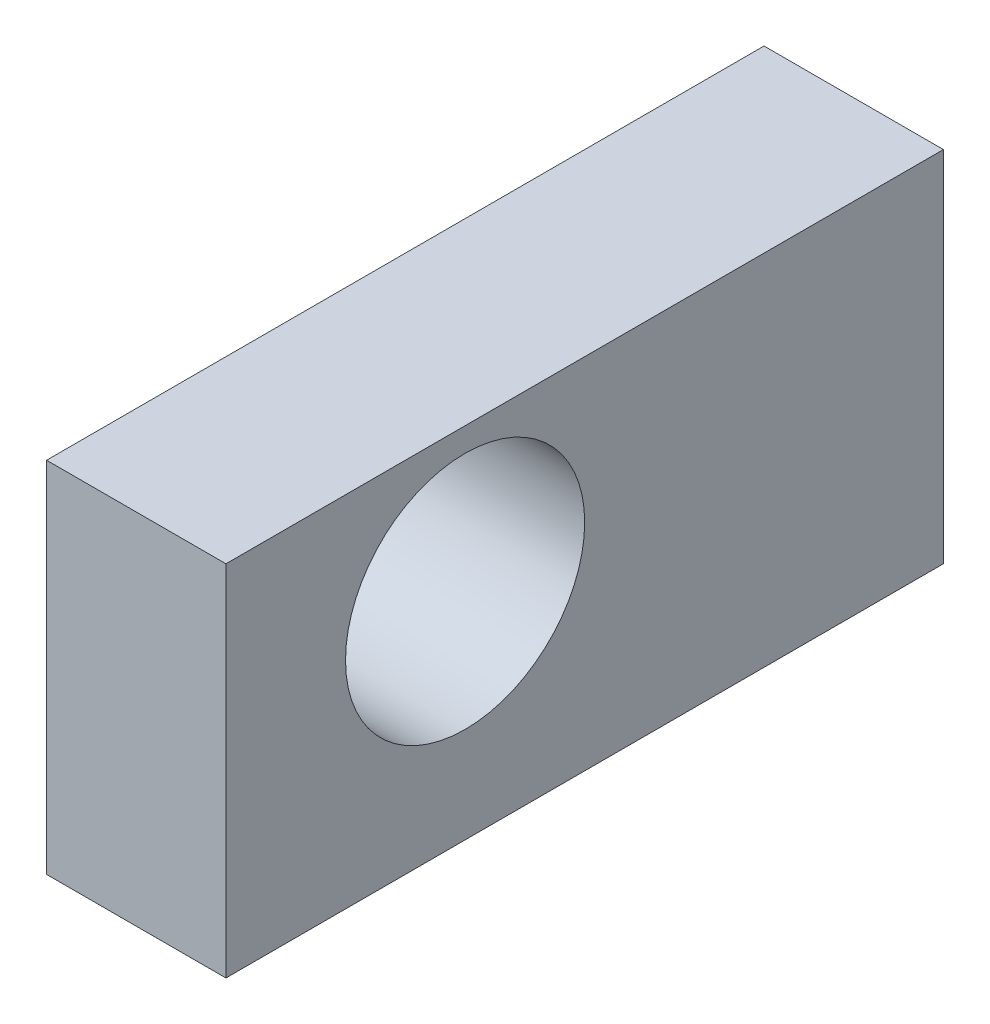
ISO-10303-21;
HEADER;
FILE_DESCRIPTION(('STEP AP214'),'2;1');
FILE_NAME('part.step','',(''),(''),'','','');
FILE_SCHEMA(('AUTOMOTIVE_DESIGN { 1 0 10303 214 1 1 1 1 }'));
ENDSEC;
DATA;
#1=APPLICATION_CONTEXT('core data for automotive mechanical design processes');
#2=APPLICATION_PROTOCOL_DEFINITION('international standard','automotive_design',2000,#1);
#3=PRODUCT_CONTEXT('',#1,'mechanical');
#4=PRODUCT('Part','Part','',(#3));
#5=PRODUCT_RELATED_PRODUCT_CATEGORY('part','',(#4));
#6=PRODUCT_DEFINITION_FORMATION('','',#4);
#7=PRODUCT_DEFINITION_CONTEXT('part definition',#1,'design');
#8=PRODUCT_DEFINITION('design','',#6,#7);
#9=PRODUCT_DEFINITION_SHAPE('','',#8);
#10=(LENGTH_UNIT() NAMED_UNIT(*) SI_UNIT(.MILLI.,.METRE.));
#11=(NAMED_UNIT(*) PLANE_ANGLE_UNIT() SI_UNIT($,.RADIAN.));
#12=(NAMED_UNIT(*) SI_UNIT($,.STERADIAN.) SOLID_ANGLE_UNIT());
#13=UNCERTAINTY_MEASURE_WITH_UNIT(LENGTH_MEASURE(1.E-05),#10,'distance_accuracy_value','');
#14=(GEOMETRIC_REPRESENTATION_CONTEXT(3) GLOBAL_UNCERTAINTY_ASSIGNED_CONTEXT((#13)) GLOBAL_UNIT_ASSIGNED_CONTEXT((#10,
#11,#12)) REPRESENTATION_CONTEXT('',''));
#15=CARTESIAN_POINT('',(0.,0.,0.));
#16=DIRECTION('',(0.,0.,1.));
#17=DIRECTION('',(1.,0.,0.));
#18=AXIS2_PLACEMENT_3D('',#15,#16,#17);
#19=CARTESIAN_POINT('',(9.525,-9.525,-19.05));
#20=DIRECTION('',(0.,0.,1.));
#21=DIRECTION('',(1.,0.,0.));
#22=AXIS2_PLACEMENT_3D('',#19,#20,#21);
#23=PLANE('',#22);
#24=CARTESIAN_POINT('',(4.7625,-3.175,-19.05));
#25=DIRECTION('',(0.,0.,-1.));
#26=DIRECTION('',(-1.,0.,0.));
#27=AXIS2_PLACEMENT_3D('',#24,#25,#26);
#28=CIRCLE('',#27,2.0193);
#29=CARTESIAN_POINT('',(2.7432,-3.175,-19.05));
#30=VERTEX_POINT('',#29);
#31=EDGE_CURVE('E104',#30,#30,#28,.T.);
#32=ORIENTED_EDGE('',*,*,#31,.F.);
#33=EDGE_LOOP('',(#32));
#34=FACE_BOUND('',#33,.T.);
#35=CARTESIAN_POINT('',(4.7625,5.715,-19.05));
#36=DIRECTION('',(0.,0.,-1.));
#37=DIRECTION('',(-1.,0.,0.));
#38=AXIS2_PLACEMENT_3D('',#35,#36,#37);
#39=CIRCLE('',#38,2.0193);
#40=CARTESIAN_POINT('',(2.7432,5.715,-19.05));
#41=VERTEX_POINT('',#40);
#42=EDGE_CURVE('E103',#41,#41,#39,.T.);
#43=ORIENTED_EDGE('',*,*,#42,.F.);
#44=EDGE_LOOP('',(#43));
#45=FACE_BOUND('',#44,.T.);
#46=DIRECTION('',(0.,1.,0.));
#47=VECTOR('',#46,1.);
#48=CARTESIAN_POINT('',(0.,-9.525,-19.05));
#49=LINE('',#48,#47);
#50=CARTESIAN_POINT('',(0.,-9.525,-19.05));
#51=VERTEX_POINT('',#50);
#52=CARTESIAN_POINT('',(0.,9.525,-19.05));
#53=VERTEX_POINT('',#52);
#54=EDGE_CURVE('E120',#51,#53,#49,.T.);
#55=ORIENTED_EDGE('',*,*,#54,.T.);
#56=DIRECTION('',(-1.,0.,0.));
#57=VECTOR('',#56,1.);
#58=CARTESIAN_POINT('',(9.525,9.525,-19.05));
#59=LINE('',#58,#57);
#60=CARTESIAN_POINT('',(9.525,9.525,-19.05));
#61=VERTEX_POINT('',#60);
#62=EDGE_CURVE('E11',#61,#53,#59,.T.);
#63=ORIENTED_EDGE('',*,*,#62,.F.);
#64=DIRECTION('',(0.,1.,0.));
#65=VECTOR('',#64,1.);
#66=CARTESIAN_POINT('',(9.525,-9.525,-19.05));
#67=LINE('',#66,#65);
#68=CARTESIAN_POINT('',(9.525,-9.525,-19.05));
#69=VERTEX_POINT('',#68);
#70=EDGE_CURVE('E121',#69,#61,#67,.T.);
#71=ORIENTED_EDGE('',*,*,#70,.F.);
#72=DIRECTION('',(-1.,0.,0.));
#73=VECTOR('',#72,1.);
#74=CARTESIAN_POINT('',(9.525,-9.525,-19.05));
#75=LINE('',#74,#73);
#76=EDGE_CURVE('E127',#69,#51,#75,.T.);
#77=ORIENTED_EDGE('',*,*,#76,.T.);
#78=EDGE_LOOP('',(#55,#63,#71,#77));
#79=FACE_BOUND('',#78,.T.);
#80=ADVANCED_FACE('F39',(#34,#45,#79),#23,.F.);
#81=CARTESIAN_POINT('',(9.525,9.525,19.05));
#82=DIRECTION('',(0.,-1.,0.));
#83=DIRECTION('',(0.,0.,-1.));
#84=AXIS2_PLACEMENT_3D('',#81,#82,#83);
#85=PLANE('',#84);
#86=DIRECTION('',(0.,0.,1.));
#87=VECTOR('',#86,1.);
#88=CARTESIAN_POINT('',(0.,9.525,19.05));
#89=LINE('',#88,#87);
#90=CARTESIAN_POINT('',(0.,9.525,19.05));
#91=VERTEX_POINT('',#90);
#92=EDGE_CURVE('E130',#53,#91,#89,.T.);
#93=ORIENTED_EDGE('',*,*,#92,.T.);
#94=DIRECTION('',(-1.,0.,0.));
#95=VECTOR('',#94,1.);
#96=CARTESIAN_POINT('',(9.525,9.525,19.05));
#97=LINE('',#96,#95);
#98=CARTESIAN_POINT('',(9.525,9.525,19.05));
#99=VERTEX_POINT('',#98);
#100=EDGE_CURVE('E47',#99,#91,#97,.T.);
#101=ORIENTED_EDGE('',*,*,#100,.F.);
#102=DIRECTION('',(0.,0.,1.));
#103=VECTOR('',#102,1.);
#104=CARTESIAN_POINT('',(9.525,9.525,19.05));
#105=LINE('',#104,#103);
#106=EDGE_CURVE('E86',#61,#99,#105,.T.);
#107=ORIENTED_EDGE('',*,*,#106,.F.);
#108=ORIENTED_EDGE('',*,*,#62,.T.);
#109=EDGE_LOOP('',(#93,#101,#107,#108));
#110=FACE_BOUND('',#109,.T.);
#111=ADVANCED_FACE('F154',(#110),#85,.F.);
#112=CARTESIAN_POINT('',(9.525,-9.525,19.05));
#113=DIRECTION('',(0.,0.,-1.));
#114=DIRECTION('',(-1.,0.,0.));
#115=AXIS2_PLACEMENT_3D('',#112,#113,#114);
#116=PLANE('',#115);
#117=DIRECTION('',(0.,-1.,0.));
#118=VECTOR('',#117,1.);
#119=CARTESIAN_POINT('',(0.,-9.525,19.05));
#120=LINE('',#119,#118);
#121=CARTESIAN_POINT('',(0.,-9.525,19.05));
#122=VERTEX_POINT('',#121);
#123=EDGE_CURVE('E73',#91,#122,#120,.T.);
#124=ORIENTED_EDGE('',*,*,#123,.T.);
#125=DIRECTION('',(-1.,0.,0.));
#126=VECTOR('',#125,1.);
#127=CARTESIAN_POINT('',(9.525,-9.525,19.05));
#128=LINE('',#127,#126);
#129=CARTESIAN_POINT('',(9.525,-9.525,19.05));
#130=VERTEX_POINT('',#129);
#131=EDGE_CURVE('E135',#130,#122,#128,.T.);
#132=ORIENTED_EDGE('',*,*,#131,.F.);
#133=DIRECTION('',(0.,-1.,0.));
#134=VECTOR('',#133,1.);
#135=CARTESIAN_POINT('',(9.525,-9.525,19.05));
#136=LINE('',#135,#134);
#137=EDGE_CURVE('E124',#99,#130,#136,.T.);
#138=ORIENTED_EDGE('',*,*,#137,.F.);
#139=ORIENTED_EDGE('',*,*,#100,.T.);
#140=EDGE_LOOP('',(#124,#132,#138,#139));
#141=FACE_BOUND('',#140,.T.);
#142=ADVANCED_FACE('F137',(#141),#116,.F.);
#143=CARTESIAN_POINT('',(9.525,-9.525,19.05));
#144=DIRECTION('',(0.,1.,0.));
#145=DIRECTION('',(0.,0.,1.));
#146=AXIS2_PLACEMENT_3D('',#143,#144,#145);
#147=PLANE('',#146);
#148=DIRECTION('',(0.,0.,-1.));
#149=VECTOR('',#148,1.);
#150=CARTESIAN_POINT('',(0.,-9.525,19.05));
#151=LINE('',#150,#149);
#152=EDGE_CURVE('E79',#122,#51,#151,.T.);
#153=ORIENTED_EDGE('',*,*,#152,.T.);
#154=ORIENTED_EDGE('',*,*,#76,.F.);
#155=DIRECTION('',(0.,0.,-1.));
#156=VECTOR('',#155,1.);
#157=CARTESIAN_POINT('',(9.525,-9.525,19.05));
#158=LINE('',#157,#156);
#159=EDGE_CURVE('E55',#130,#69,#158,.T.);
#160=ORIENTED_EDGE('',*,*,#159,.F.);
#161=ORIENTED_EDGE('',*,*,#131,.T.);
#162=EDGE_LOOP('',(#153,#154,#160,#161));
#163=FACE_BOUND('',#162,.T.);
#164=ADVANCED_FACE('F144',(#163),#147,.F.);
#165=CARTESIAN_POINT('',(9.525,0.,0.));
#166=DIRECTION('',(-1.,0.,0.));
#167=DIRECTION('',(0.,0.,1.));
#168=AXIS2_PLACEMENT_3D('',#165,#166,#167);
#169=PLANE('',#168);
#170=CARTESIAN_POINT('',(9.525,1.905,6.35));
#171=DIRECTION('',(1.,0.,0.));
#172=DIRECTION('',(0.,0.,-1.));
#173=AXIS2_PLACEMENT_3D('',#170,#171,#172);
#174=CIRCLE('',#173,6.34999999999999);
#175=CARTESIAN_POINT('',(9.525,1.905,0.));
#176=VERTEX_POINT('',#175);
#177=EDGE_CURVE('E114',#176,#176,#174,.T.);
#178=ORIENTED_EDGE('',*,*,#177,.F.);
#179=EDGE_LOOP('',(#178));
#180=FACE_BOUND('',#179,.T.);
#181=ORIENTED_EDGE('',*,*,#70,.T.);
#182=ORIENTED_EDGE('',*,*,#106,.T.);
#183=ORIENTED_EDGE('',*,*,#137,.T.);
#184=ORIENTED_EDGE('',*,*,#159,.T.);
#185=EDGE_LOOP('',(#181,#182,#183,#184));
#186=FACE_BOUND('',#185,.T.);
#187=ADVANCED_FACE('F146',(#180,#186),#169,.F.);
#188=CARTESIAN_POINT('',(0.,0.,0.));
#189=DIRECTION('',(-1.,0.,0.));
#190=DIRECTION('',(0.,0.,1.));
#191=AXIS2_PLACEMENT_3D('',#188,#189,#190);
#192=PLANE('',#191);
#193=CARTESIAN_POINT('',(0.,1.905,6.35));
#194=DIRECTION('',(-1.,0.,0.));
#195=DIRECTION('',(0.,0.,1.));
#196=AXIS2_PLACEMENT_3D('',#193,#194,#195);
#197=CIRCLE('',#196,6.34999999999999);
#198=CARTESIAN_POINT('',(0.,1.905,12.7));
#199=VERTEX_POINT('',#198);
#200=EDGE_CURVE('E117',#199,#199,#197,.T.);
#201=ORIENTED_EDGE('',*,*,#200,.F.);
#202=EDGE_LOOP('',(#201));
#203=FACE_BOUND('',#202,.T.);
#204=ORIENTED_EDGE('',*,*,#54,.F.);
#205=ORIENTED_EDGE('',*,*,#152,.F.);
#206=ORIENTED_EDGE('',*,*,#123,.F.);
#207=ORIENTED_EDGE('',*,*,#92,.F.);
#208=EDGE_LOOP('',(#204,#205,#206,#207));
#209=FACE_BOUND('',#208,.T.);
#210=ADVANCED_FACE('F140',(#203,#209),#192,.T.);
#211=CARTESIAN_POINT('',(9.525,1.905,6.35));
#212=DIRECTION('',(1.,0.,0.));
#213=DIRECTION('',(0.,0.,-1.));
#214=AXIS2_PLACEMENT_3D('',#211,#212,#213);
#215=CYLINDRICAL_SURFACE('',#214,6.34999999999999);
#216=ORIENTED_EDGE('',*,*,#200,.T.);
#217=EDGE_LOOP('',(#216));
#218=FACE_BOUND('',#217,.T.);
#219=ORIENTED_EDGE('',*,*,#177,.T.);
#220=EDGE_LOOP('',(#219));
#221=FACE_BOUND('',#220,.T.);
#222=ADVANCED_FACE('F173',(#218,#221),#215,.F.);
#223=CARTESIAN_POINT('',(4.7625,5.715,-7.112));
#224=DIRECTION('',(0.,0.,-1.));
#225=DIRECTION('',(-1.,0.,0.));
#226=AXIS2_PLACEMENT_3D('',#223,#224,#225);
#227=CONICAL_SURFACE('',#226,2.0193,1.02974425867665);
#228=CARTESIAN_POINT('',(4.7625,5.715,-5.89868215199765));
#229=VERTEX_POINT('',#228);
#230=VERTEX_LOOP('',#229);
#231=FACE_BOUND('',#230,.T.);
#232=CARTESIAN_POINT('',(4.7625,5.715,-7.112));
#233=DIRECTION('',(0.,0.,-1.));
#234=DIRECTION('',(-1.,0.,0.));
#235=AXIS2_PLACEMENT_3D('',#232,#233,#234);
#236=CIRCLE('',#235,2.0193);
#237=CARTESIAN_POINT('',(2.7432,5.715,-7.112));
#238=VERTEX_POINT('',#237);
#239=EDGE_CURVE('E107',#238,#238,#236,.T.);
#240=ORIENTED_EDGE('',*,*,#239,.T.);
#241=EDGE_LOOP('',(#240));
#242=FACE_BOUND('',#241,.T.);
#243=ADVANCED_FACE('F167',(#231,#242),#227,.F.);
#244=CARTESIAN_POINT('',(4.7625,5.715,-19.05));
#245=DIRECTION('',(0.,0.,-1.));
#246=DIRECTION('',(-1.,0.,0.));
#247=AXIS2_PLACEMENT_3D('',#244,#245,#246);
#248=CYLINDRICAL_SURFACE('',#247,2.0193);
#249=ORIENTED_EDGE('',*,*,#239,.F.);
#250=EDGE_LOOP('',(#249));
#251=FACE_BOUND('',#250,.T.);
#252=ORIENTED_EDGE('',*,*,#42,.T.);
#253=EDGE_LOOP('',(#252));
#254=FACE_BOUND('',#253,.T.);
#255=ADVANCED_FACE('F97',(#251,#254),#248,.F.);
#256=CARTESIAN_POINT('',(4.7625,-3.175,-7.112));
#257=DIRECTION('',(0.,0.,-1.));
#258=DIRECTION('',(-1.,0.,0.));
#259=AXIS2_PLACEMENT_3D('',#256,#257,#258);
#260=CONICAL_SURFACE('',#259,2.0193,1.02974425867665);
#261=CARTESIAN_POINT('',(4.7625,-3.175,-5.89868215199765));
#262=VERTEX_POINT('',#261);
#263=VERTEX_LOOP('',#262);
#264=FACE_BOUND('',#263,.T.);
#265=CARTESIAN_POINT('',(4.7625,-3.175,-7.112));
#266=DIRECTION('',(0.,0.,-1.));
#267=DIRECTION('',(-1.,0.,0.));
#268=AXIS2_PLACEMENT_3D('',#265,#266,#267);
#269=CIRCLE('',#268,2.0193);
#270=CARTESIAN_POINT('',(2.7432,-3.175,-7.112));
#271=VERTEX_POINT('',#270);
#272=EDGE_CURVE('E101',#271,#271,#269,.T.);
#273=ORIENTED_EDGE('',*,*,#272,.T.);
#274=EDGE_LOOP('',(#273));
#275=FACE_BOUND('',#274,.T.);
#276=ADVANCED_FACE('F93',(#264,#275),#260,.F.);
#277=CARTESIAN_POINT('',(4.7625,-3.175,-19.05));
#278=DIRECTION('',(0.,0.,-1.));
#279=DIRECTION('',(-1.,0.,0.));
#280=AXIS2_PLACEMENT_3D('',#277,#278,#279);
#281=CYLINDRICAL_SURFACE('',#280,2.0193);
#282=ORIENTED_EDGE('',*,*,#272,.F.);
#283=EDGE_LOOP('',(#282));
#284=FACE_BOUND('',#283,.T.);
#285=ORIENTED_EDGE('',*,*,#31,.T.);
#286=EDGE_LOOP('',(#285));
#287=FACE_BOUND('',#286,.T.);
#288=ADVANCED_FACE('F96',(#284,#287),#281,.F.);
#289=CLOSED_SHELL('',(#80,#111,#142,#164,#187,#210,#222,#243,#255,#276,#288));
#290=MANIFOLD_SOLID_BREP('B2',#289);
#291=ADVANCED_BREP_SHAPE_REPRESENTATION('',(#18,#290),#14);
#292=SHAPE_DEFINITION_REPRESENTATION(#9,#291);
ENDSEC;
END-ISO-10303-21;
